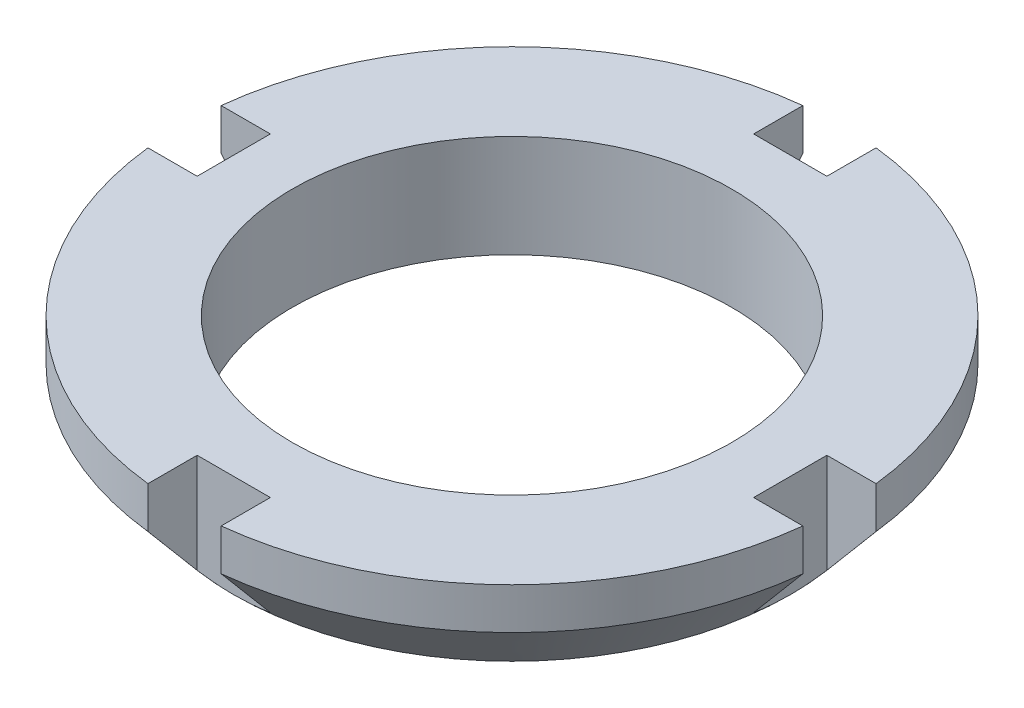
ISO-10303-21;
HEADER;
FILE_DESCRIPTION(('STEP AP214'),'2;1');
FILE_NAME('part.step','',(''),(''),'','','');
FILE_SCHEMA(('AUTOMOTIVE_DESIGN { 1 0 10303 214 1 1 1 1 }'));
ENDSEC;
DATA;
#1=APPLICATION_CONTEXT('core data for automotive mechanical design processes');
#2=APPLICATION_PROTOCOL_DEFINITION('international standard','automotive_design',2000,#1);
#3=PRODUCT_CONTEXT('',#1,'mechanical');
#4=PRODUCT('Part','Part','',(#3));
#5=PRODUCT_RELATED_PRODUCT_CATEGORY('part','',(#4));
#6=PRODUCT_DEFINITION_FORMATION('','',#4);
#7=PRODUCT_DEFINITION_CONTEXT('part definition',#1,'design');
#8=PRODUCT_DEFINITION('design','',#6,#7);
#9=PRODUCT_DEFINITION_SHAPE('','',#8);
#10=(LENGTH_UNIT() NAMED_UNIT(*) SI_UNIT(.MILLI.,.METRE.));
#11=(NAMED_UNIT(*) PLANE_ANGLE_UNIT() SI_UNIT($,.RADIAN.));
#12=(NAMED_UNIT(*) SI_UNIT($,.STERADIAN.) SOLID_ANGLE_UNIT());
#13=UNCERTAINTY_MEASURE_WITH_UNIT(LENGTH_MEASURE(1.E-05),#10,'distance_accuracy_value','');
#14=(GEOMETRIC_REPRESENTATION_CONTEXT(3) GLOBAL_UNCERTAINTY_ASSIGNED_CONTEXT((#13)) GLOBAL_UNIT_ASSIGNED_CONTEXT((#10,
#11,#12)) REPRESENTATION_CONTEXT('',''));
#15=CARTESIAN_POINT('',(0.,0.,0.));
#16=DIRECTION('',(0.,0.,1.));
#17=DIRECTION('',(1.,0.,0.));
#18=AXIS2_PLACEMENT_3D('',#15,#16,#17);
#19=CARTESIAN_POINT('',(0.,25.4,0.));
#20=DIRECTION('',(0.,1.,0.));
#21=DIRECTION('',(0.,0.,1.));
#22=AXIS2_PLACEMENT_3D('',#19,#20,#21);
#23=CYLINDRICAL_SURFACE('',#22,22.5);
#24=CARTESIAN_POINT('',(0.,4.17113757407976,0.));
#25=DIRECTION('',(0.,1.,0.));
#26=DIRECTION('',(0.,0.,1.));
#27=AXIS2_PLACEMENT_3D('',#24,#25,#26);
#28=CIRCLE('',#27,22.5);
#29=CARTESIAN_POINT('',(2.50000000000017,4.17113757407975,22.3606797749979));
#30=VERTEX_POINT('',#29);
#31=CARTESIAN_POINT('',(22.3606797749979,4.17113757407975,2.49999999999975));
#32=VERTEX_POINT('',#31);
#33=EDGE_CURVE('E186',#30,#32,#28,.T.);
#34=ORIENTED_EDGE('',*,*,#33,.T.);
#35=DIRECTION('',(0.,1.,0.));
#36=VECTOR('',#35,1.);
#37=CARTESIAN_POINT('',(22.3606797749979,0.,2.49999999999975));
#38=LINE('',#37,#36);
#39=CARTESIAN_POINT('',(22.3606797749979,7.,2.49999999999975));
#40=VERTEX_POINT('',#39);
#41=EDGE_CURVE('E171',#32,#40,#38,.T.);
#42=ORIENTED_EDGE('',*,*,#41,.T.);
#43=CARTESIAN_POINT('',(0.,7.,0.));
#44=DIRECTION('',(0.,1.,0.));
#45=DIRECTION('',(0.,0.,1.));
#46=AXIS2_PLACEMENT_3D('',#43,#44,#45);
#47=CIRCLE('',#46,22.5);
#48=CARTESIAN_POINT('',(2.50000000000017,7.,22.3606797749979));
#49=VERTEX_POINT('',#48);
#50=EDGE_CURVE('E184',#49,#40,#47,.T.);
#51=ORIENTED_EDGE('',*,*,#50,.F.);
#52=DIRECTION('',(0.,1.,0.));
#53=VECTOR('',#52,1.);
#54=CARTESIAN_POINT('',(2.50000000000017,0.,22.3606797749979));
#55=LINE('',#54,#53);
#56=EDGE_CURVE('E439',#30,#49,#55,.T.);
#57=ORIENTED_EDGE('',*,*,#56,.F.);
#58=EDGE_LOOP('',(#34,#42,#51,#57));
#59=FACE_BOUND('',#58,.T.);
#60=ADVANCED_FACE('F38',(#59),#23,.T.);
#61=CARTESIAN_POINT('',(0.,0.,0.));
#62=DIRECTION('',(0.,1.,0.));
#63=DIRECTION('',(0.,0.,1.));
#64=AXIS2_PLACEMENT_3D('',#61,#62,#63);
#65=CONICAL_SURFACE('',#64,19.,0.69813170079773);
#66=CARTESIAN_POINT('',(18.9999999999999,1.73637000129293,-7.58210621238856));
#67=CARTESIAN_POINT('',(18.9999999999999,1.53677036974403,-7.13024720071158));
#68=CARTESIAN_POINT('',(18.9999999999999,1.34993350006571,-6.67240220489217));
#69=CARTESIAN_POINT('',(18.9999999999999,1.00649976623934,-5.74464652234664));
#70=CARTESIAN_POINT('',(18.9999999999999,0.849956457997306,-5.27471610123703));
#71=CARTESIAN_POINT('',(18.9999999999999,0.573877768075691,-4.32880251710928));
#72=CARTESIAN_POINT('',(18.9999999999999,0.454004671009789,-3.85291938441721));
#73=CARTESIAN_POINT('',(19.,0.254074297918986,-2.89306623574916));
#74=CARTESIAN_POINT('',(19.,0.173993196100716,-2.40910123873751));
#75=CARTESIAN_POINT('',(19.,0.0567546419420003,-1.43181727263717));
#76=CARTESIAN_POINT('',(19.,0.019961286449687,-0.938453938233916));
#77=CARTESIAN_POINT('',(19.,-0.00757543623294828,0.049649599400212));
#78=CARTESIAN_POINT('',(19.,0.00168845560253439,0.544390007388378));
#79=CARTESIAN_POINT('',(19.,0.0659302147367227,1.53295755377141));
#80=CARTESIAN_POINT('',(19.,0.121101073277712,2.02677200049547));
#81=CARTESIAN_POINT('',(19.,0.274586154589837,3.00749402882903));
#82=CARTESIAN_POINT('',(19.,0.372897275601999,3.49440210440469));
#83=CARTESIAN_POINT('',(19.0000000000001,0.646381123210521,4.6145864154824));
#84=CARTESIAN_POINT('',(19.,0.836127071739753,5.24429515918784));
#85=CARTESIAN_POINT('',(19.0000000000001,1.27196341598445,6.48452605869457));
#86=CARTESIAN_POINT('',(19.0000000000001,1.51813336581001,7.0950197270077));
#87=CARTESIAN_POINT('',(19.0000000000001,1.92041860521065,7.9942120232412));
#88=CARTESIAN_POINT('',(19.0000000000001,2.0597111896602,8.29061541789972));
#89=CARTESIAN_POINT('',(19.0000000000001,2.34822814442477,8.87858969377929));
#90=CARTESIAN_POINT('',(19.0000000000001,2.49745323904561,9.17016022063368));
#91=CARTESIAN_POINT('',(19.0000000000001,2.80413323156645,9.74756118853287));
#92=CARTESIAN_POINT('',(19.0000000000001,2.96155628495981,10.0334086256483));
#93=CARTESIAN_POINT('',(19.0000000000001,3.28413034619789,10.6006106209937));
#94=CARTESIAN_POINT('',(19.0000000000001,3.44927922447967,10.8819663889702));
#95=CARTESIAN_POINT('',(19.0000000000001,3.61783661500378,11.1612361569684));
#96=B_SPLINE_CURVE_WITH_KNOTS('',3,(#66,#67,#68,#69,#70,#71,#72,#73,#74,#75,#76,#77,#78,#79,#80,
#81,#82,#83,#84,#85,#86,#87,#88,#89,#90,#91,#92,#93,#94,#95),.UNSPECIFIED.,.F.,.F.,(4,2,2,2,2,2,
2,2,2,2,2,2,2,2,4),(0.,1.48222106824656,2.96703907991057,4.43773962260794,5.90755850661073,
7.38965372964356,8.87198255127641,10.3605747014282,11.8490598402301,13.8187305058232,
15.7911955483557,16.7735543012806,17.755984769145,18.7348485928211,19.7134441721424),.UNSPECIFIED.);
#97=CARTESIAN_POINT('',(19.,0.,-1.94289029309402E-13));
#98=VERTEX_POINT('',#97);
#99=CARTESIAN_POINT('',(19.,0.19517097928768,2.49999999999981));
#100=VERTEX_POINT('',#99);
#101=EDGE_CURVE('E52',#98,#100,#96,.T.);
#102=ORIENTED_EDGE('',*,*,#101,.T.);
#103=CARTESIAN_POINT('',(12.821751673189,-7.07519717585949,2.49999999999986));
#104=CARTESIAN_POINT('',(13.3665510130067,-6.43787375979153,2.49999999999986));
#105=CARTESIAN_POINT('',(13.9106740738706,-5.79997326494708,2.49999999999986));
#106=CARTESIAN_POINT('',(14.9978741108621,-4.5232824494922,2.49999999999985));
#107=CARTESIAN_POINT('',(15.5409510880725,-3.88449212980409,2.49999999999984));
#108=CARTESIAN_POINT('',(16.6263652315369,-2.60628623745577,2.49999999999983));
#109=CARTESIAN_POINT('',(17.1687023995962,-1.96687066632784,2.49999999999983));
#110=CARTESIAN_POINT('',(18.2528125580392,-0.687561145140533,2.49999999999982));
#111=CARTESIAN_POINT('',(18.7945855482542,-0.0476671949381191,2.49999999999981));
#112=CARTESIAN_POINT('',(20.4192599599757,1.8725547330562,2.4999999999998));
#113=CARTESIAN_POINT('',(21.5015194094135,3.15342583739105,2.49999999999978));
#114=CARTESIAN_POINT('',(23.1241041677456,5.07541398166614,2.49999999999976));
#115=CARTESIAN_POINT('',(23.6648323574213,5.71619107610534,2.49999999999976));
#116=CARTESIAN_POINT('',(24.7460642785374,6.99793443299102,2.49999999999975));
#117=CARTESIAN_POINT('',(25.2865680100147,7.63890069540624,2.49999999999974));
#118=CARTESIAN_POINT('',(25.8269816670673,8.279942915746,2.49999999999972));
#119=B_SPLINE_CURVE_WITH_KNOTS('',3,(#103,#104,#105,#106,#107,#108,#109,#110,#111,#112,#113,
#114,#115,#116,#117,#118),.UNSPECIFIED.,.F.,.F.,(4,2,2,2,2,2,2,4),(0.,2.51532883948252,
5.03065507368705,7.54597515902335,10.0612959967228,15.0919256761954,17.6072467806086,
20.1225674695423),.UNSPECIFIED.);
#120=EDGE_CURVE('E11',#100,#32,#119,.T.);
#121=ORIENTED_EDGE('',*,*,#120,.T.);
#122=ORIENTED_EDGE('',*,*,#33,.F.);
#123=CARTESIAN_POINT('',(2.5000000000002,8.279942915746,25.8269816670672));
#124=CARTESIAN_POINT('',(2.50000000000019,7.63890069540623,25.2865680100147));
#125=CARTESIAN_POINT('',(2.50000000000018,6.99793443299102,24.7460642785373));
#126=CARTESIAN_POINT('',(2.50000000000017,5.71619107610534,23.6648323574213));
#127=CARTESIAN_POINT('',(2.50000000000017,5.07541398166614,23.1241041677456));
#128=CARTESIAN_POINT('',(2.50000000000016,3.15342583739105,21.5015194094134));
#129=CARTESIAN_POINT('',(2.50000000000015,1.8725547330562,20.4192599599756));
#130=CARTESIAN_POINT('',(2.50000000000014,-0.0476671949381199,18.7945855482542));
#131=CARTESIAN_POINT('',(2.50000000000014,-0.687561145140537,18.2528125580392));
#132=CARTESIAN_POINT('',(2.50000000000013,-1.96687066632785,17.1687023995961));
#133=CARTESIAN_POINT('',(2.50000000000012,-2.60628623745578,16.6263652315369));
#134=CARTESIAN_POINT('',(2.50000000000012,-3.8844921298041,15.5409510880725));
#135=CARTESIAN_POINT('',(2.50000000000011,-4.5232824494922,14.997874110862));
#136=CARTESIAN_POINT('',(2.5000000000001,-5.79997326494708,13.9106740738706));
#137=CARTESIAN_POINT('',(2.5000000000001,-6.43787375979153,13.3665510130066));
#138=CARTESIAN_POINT('',(2.50000000000009,-7.07519717585949,12.8217516731889));
#139=B_SPLINE_CURVE_WITH_KNOTS('',3,(#123,#124,#125,#126,#127,#128,#129,#130,#131,#132,#133,
#134,#135,#136,#137,#138),.UNSPECIFIED.,.F.,.F.,(4,2,2,2,2,2,2,4),(0.,2.51532068893367,
5.03064179334688,10.0612714728195,12.5765923105189,15.0919123958552,17.6072386300598,
20.1225674695423),.UNSPECIFIED.);
#140=CARTESIAN_POINT('',(2.50000000000014,0.19517097928768,19.));
#141=VERTEX_POINT('',#140);
#142=EDGE_CURVE('E282',#30,#141,#139,.T.);
#143=ORIENTED_EDGE('',*,*,#142,.T.);
#144=CARTESIAN_POINT('',(-7.58210621238822,1.73637000129293,19.));
#145=CARTESIAN_POINT('',(-7.13024720071124,1.53677036974405,19.0000000000001));
#146=CARTESIAN_POINT('',(-6.67240220489183,1.34993350006573,19.0000000000001));
#147=CARTESIAN_POINT('',(-5.7446465223463,1.00649976623936,19.));
#148=CARTESIAN_POINT('',(-5.27471610123669,0.849956457997325,19.));
#149=CARTESIAN_POINT('',(-4.32880251710894,0.573877768075712,19.));
#150=CARTESIAN_POINT('',(-3.85291938441687,0.454004671009814,19.));
#151=CARTESIAN_POINT('',(-2.89306623574882,0.254074297919004,19.));
#152=CARTESIAN_POINT('',(-2.40910123873717,0.173993196100722,19.));
#153=CARTESIAN_POINT('',(-1.43181727263684,0.0567546419420076,19.));
#154=CARTESIAN_POINT('',(-0.938453938233584,0.0199612864497069,19.));
#155=CARTESIAN_POINT('',(0.0496495994005433,-0.00757543623292095,19.));
#156=CARTESIAN_POINT('',(0.544390007388709,0.00168845560255643,19.));
#157=CARTESIAN_POINT('',(1.53295755377174,0.0659302147367443,19.));
#158=CARTESIAN_POINT('',(2.0267720004958,0.121101073277739,19.));
#159=CARTESIAN_POINT('',(3.00749402882936,0.274586154589858,19.));
#160=CARTESIAN_POINT('',(3.49440210440503,0.372897275602008,19.));
#161=CARTESIAN_POINT('',(4.61458641548274,0.646381123210525,19.));
#162=CARTESIAN_POINT('',(5.24429515918817,0.836127071739771,19.));
#163=CARTESIAN_POINT('',(6.48452605869491,1.27196341598448,19.));
#164=CARTESIAN_POINT('',(7.09501972700804,1.51813336581003,19.));
#165=CARTESIAN_POINT('',(7.99421202324155,1.92041860521067,19.));
#166=CARTESIAN_POINT('',(8.29061541790007,2.05971118966023,19.));
#167=CARTESIAN_POINT('',(8.87858969377964,2.34822814442479,18.9999999999999));
#168=CARTESIAN_POINT('',(9.17016022063403,2.49745323904563,18.9999999999999));
#169=CARTESIAN_POINT('',(9.74756118853323,2.80413323156648,18.9999999999999));
#170=CARTESIAN_POINT('',(10.0334086256487,2.96155628495984,18.9999999999999));
#171=CARTESIAN_POINT('',(10.6006106209941,3.28413034619792,18.9999999999999));
#172=CARTESIAN_POINT('',(10.8819663889706,3.4492792244797,18.9999999999999));
#173=CARTESIAN_POINT('',(11.1612361569687,3.6178366150038,18.9999999999999));
#174=B_SPLINE_CURVE_WITH_KNOTS('',3,(#144,#145,#146,#147,#148,#149,#150,#151,#152,#153,#154,
#155,#156,#157,#158,#159,#160,#161,#162,#163,#164,#165,#166,#167,#168,#169,#170,#171,#172,#173),
.UNSPECIFIED.,.F.,.F.,(4,2,2,2,2,2,2,2,2,2,2,2,2,2,4),(0.,1.48222106824655,2.96703907991057,
4.43773962260794,5.90755850661072,7.38965372964355,8.8719825512764,10.3605747014282,
11.8490598402301,13.8187305058232,15.7911955483557,16.7735543012806,17.7559847691451,
18.7348485928211,19.7134441721424),.UNSPECIFIED.);
#175=CARTESIAN_POINT('',(1.38777878078145E-13,0.,19.));
#176=VERTEX_POINT('',#175);
#177=EDGE_CURVE('E291',#141,#176,#174,.F.);
#178=ORIENTED_EDGE('',*,*,#177,.T.);
#179=CARTESIAN_POINT('',(0.,0.,0.));
#180=DIRECTION('',(0.,1.,0.));
#181=DIRECTION('',(0.,0.,1.));
#182=AXIS2_PLACEMENT_3D('',#179,#180,#181);
#183=CIRCLE('',#182,19.);
#184=EDGE_CURVE('E392',#176,#98,#183,.T.);
#185=ORIENTED_EDGE('',*,*,#184,.T.);
#186=EDGE_LOOP('',(#102,#121,#122,#143,#178,#185));
#187=FACE_BOUND('',#186,.T.);
#188=ADVANCED_FACE('F339',(#187),#65,.T.);
#189=CARTESIAN_POINT('',(-22.3606797749979,4.17113757407975,2.50000000000009));
#190=VERTEX_POINT('',#189);
#191=CARTESIAN_POINT('',(-2.49999999999984,4.17113757407975,22.3606797749979));
#192=VERTEX_POINT('',#191);
#193=EDGE_CURVE('E377',#190,#192,#28,.T.);
#194=ORIENTED_EDGE('',*,*,#193,.T.);
#195=DIRECTION('',(0.,1.,0.));
#196=VECTOR('',#195,1.);
#197=CARTESIAN_POINT('',(-2.49999999999984,0.,22.3606797749979));
#198=LINE('',#197,#196);
#199=CARTESIAN_POINT('',(-2.49999999999984,7.,22.3606797749979));
#200=VERTEX_POINT('',#199);
#201=EDGE_CURVE('E436',#192,#200,#198,.T.);
#202=ORIENTED_EDGE('',*,*,#201,.T.);
#203=CARTESIAN_POINT('',(-22.3606797749979,7.,2.50000000000009));
#204=VERTEX_POINT('',#203);
#205=EDGE_CURVE('E194',#204,#200,#47,.T.);
#206=ORIENTED_EDGE('',*,*,#205,.F.);
#207=DIRECTION('',(0.,1.,0.));
#208=VECTOR('',#207,1.);
#209=CARTESIAN_POINT('',(-22.3606797749979,0.,2.50000000000009));
#210=LINE('',#209,#208);
#211=EDGE_CURVE('E422',#190,#204,#210,.T.);
#212=ORIENTED_EDGE('',*,*,#211,.F.);
#213=EDGE_LOOP('',(#194,#202,#206,#212));
#214=FACE_BOUND('',#213,.T.);
#215=ADVANCED_FACE('F340',(#214),#23,.T.);
#216=CARTESIAN_POINT('',(-2.49999999999986,0.195170979287673,19.));
#217=VERTEX_POINT('',#216);
#218=EDGE_CURVE('E314',#176,#217,#174,.F.);
#219=ORIENTED_EDGE('',*,*,#218,.T.);
#220=CARTESIAN_POINT('',(-2.49999999999992,-7.07519717585949,12.8217516731889));
#221=CARTESIAN_POINT('',(-2.49999999999991,-6.43787375979153,13.3665510130067));
#222=CARTESIAN_POINT('',(-2.4999999999999,-5.79997326494708,13.9106740738706));
#223=CARTESIAN_POINT('',(-2.49999999999989,-4.5232824494922,14.9978741108621));
#224=CARTESIAN_POINT('',(-2.49999999999989,-3.8844921298041,15.5409510880725));
#225=CARTESIAN_POINT('',(-2.49999999999988,-2.60628623745577,16.6263652315369));
#226=CARTESIAN_POINT('',(-2.49999999999988,-1.96687066632784,17.1687023995962));
#227=CARTESIAN_POINT('',(-2.49999999999987,-0.687561145140531,18.2528125580392));
#228=CARTESIAN_POINT('',(-2.49999999999987,-0.0476671949381194,18.7945855482542));
#229=CARTESIAN_POINT('',(-2.49999999999986,1.8725547330562,20.4192599599757));
#230=CARTESIAN_POINT('',(-2.49999999999985,3.15342583739105,21.5015194094135));
#231=CARTESIAN_POINT('',(-2.49999999999983,5.07541398166614,23.1241041677456));
#232=CARTESIAN_POINT('',(-2.49999999999983,5.71619107610534,23.6648323574213));
#233=CARTESIAN_POINT('',(-2.49999999999982,6.99793443299101,24.7460642785373));
#234=CARTESIAN_POINT('',(-2.49999999999982,7.63890069540623,25.2865680100147));
#235=CARTESIAN_POINT('',(-2.49999999999981,8.279942915746,25.8269816670673));
#236=B_SPLINE_CURVE_WITH_KNOTS('',3,(#220,#221,#222,#223,#224,#225,#226,#227,#228,#229,#230,
#231,#232,#233,#234,#235),.UNSPECIFIED.,.F.,.F.,(4,2,2,2,2,2,2,4),(0.,2.51532883948253,
5.03065507368706,7.54597515902337,10.0612959967228,15.0919256761954,17.6072467806086,
20.1225674695423),.UNSPECIFIED.);
#237=EDGE_CURVE('E306',#217,#192,#236,.T.);
#238=ORIENTED_EDGE('',*,*,#237,.T.);
#239=ORIENTED_EDGE('',*,*,#193,.F.);
#240=CARTESIAN_POINT('',(-25.8269816670672,8.279942915746,2.50000000000009));
#241=CARTESIAN_POINT('',(-25.2865680100147,7.63890069540623,2.50000000000008));
#242=CARTESIAN_POINT('',(-24.7460642785373,6.99793443299101,2.50000000000008));
#243=CARTESIAN_POINT('',(-23.6648323574213,5.71619107610534,2.50000000000007));
#244=CARTESIAN_POINT('',(-23.1241041677456,5.07541398166614,2.50000000000007));
#245=CARTESIAN_POINT('',(-21.5015194094134,3.15342583739105,2.50000000000007));
#246=CARTESIAN_POINT('',(-20.4192599599756,1.8725547330562,2.50000000000006));
#247=CARTESIAN_POINT('',(-18.7945855482542,-0.0476671949381199,2.50000000000006));
#248=CARTESIAN_POINT('',(-18.2528125580392,-0.687561145140533,2.50000000000005));
#249=CARTESIAN_POINT('',(-17.1687023995962,-1.96687066632784,2.50000000000005));
#250=CARTESIAN_POINT('',(-16.6263652315369,-2.60628623745577,2.50000000000005));
#251=CARTESIAN_POINT('',(-15.5409510880725,-3.8844921298041,2.50000000000005));
#252=CARTESIAN_POINT('',(-14.9978741108621,-4.5232824494922,2.50000000000004));
#253=CARTESIAN_POINT('',(-13.9106740738706,-5.79997326494709,2.50000000000004));
#254=CARTESIAN_POINT('',(-13.3665510130067,-6.43787375979153,2.50000000000005));
#255=CARTESIAN_POINT('',(-12.8217516731889,-7.07519717585949,2.50000000000006));
#256=B_SPLINE_CURVE_WITH_KNOTS('',3,(#240,#241,#242,#243,#244,#245,#246,#247,#248,#249,#250,
#251,#252,#253,#254,#255),.UNSPECIFIED.,.F.,.F.,(4,2,2,2,2,2,2,4),(0.,2.51532068893366,
5.03064179334687,10.0612714728195,12.5765923105189,15.0919123958552,17.6072386300598,
20.1225674695423),.UNSPECIFIED.);
#257=CARTESIAN_POINT('',(-19.,0.195170979287673,2.50000000000006));
#258=VERTEX_POINT('',#257);
#259=EDGE_CURVE('E248',#190,#258,#256,.T.);
#260=ORIENTED_EDGE('',*,*,#259,.T.);
#261=CARTESIAN_POINT('',(-19.,1.73637000129293,-7.58210621238828));
#262=CARTESIAN_POINT('',(-19.,1.53677036974404,-7.1302472007113));
#263=CARTESIAN_POINT('',(-19.,1.34993350006572,-6.67240220489189));
#264=CARTESIAN_POINT('',(-19.,1.00649976623935,-5.74464652234636));
#265=CARTESIAN_POINT('',(-19.,0.849956457997312,-5.27471610123675));
#266=CARTESIAN_POINT('',(-19.,0.573877768075697,-4.328802517109));
#267=CARTESIAN_POINT('',(-19.,0.454004671009796,-3.85291938441693));
#268=CARTESIAN_POINT('',(-19.,0.25407429791899,-2.89306623574888));
#269=CARTESIAN_POINT('',(-19.,0.173993196100713,-2.40910123873723));
#270=CARTESIAN_POINT('',(-19.,0.0567546419420028,-1.4318172726369));
#271=CARTESIAN_POINT('',(-19.,0.0199612864496999,-0.938453938233644));
#272=CARTESIAN_POINT('',(-19.,-0.0075754362329302,0.04964959940048));
#273=CARTESIAN_POINT('',(-19.,0.00168845560254711,0.544390007388643));
#274=CARTESIAN_POINT('',(-19.,0.0659302147367331,1.53295755377167));
#275=CARTESIAN_POINT('',(-19.,0.121101073277726,2.02677200049573));
#276=CARTESIAN_POINT('',(-19.,0.274586154589847,3.00749402882928));
#277=CARTESIAN_POINT('',(-19.,0.372897275602001,3.49440210440494));
#278=CARTESIAN_POINT('',(-19.,0.646381123210519,4.61458641548265));
#279=CARTESIAN_POINT('',(-19.,0.836127071739759,5.24429515918809));
#280=CARTESIAN_POINT('',(-19.,1.27196341598446,6.48452605869482));
#281=CARTESIAN_POINT('',(-19.,1.51813336581001,7.09501972700796));
#282=CARTESIAN_POINT('',(-19.,1.92041860521066,7.99421202324147));
#283=CARTESIAN_POINT('',(-19.,2.05971118966021,8.29061541789999));
#284=CARTESIAN_POINT('',(-19.,2.34822814442478,8.87858969377956));
#285=CARTESIAN_POINT('',(-19.,2.49745323904562,9.17016022063395));
#286=CARTESIAN_POINT('',(-19.,2.80413323156646,9.74756118853314));
#287=CARTESIAN_POINT('',(-19.,2.96155628495982,10.0334086256486));
#288=CARTESIAN_POINT('',(-19.,3.2841303461979,10.600610620994));
#289=CARTESIAN_POINT('',(-19.,3.44927922447968,10.8819663889705));
#290=CARTESIAN_POINT('',(-19.,3.61783661500379,11.1612361569687));
#291=B_SPLINE_CURVE_WITH_KNOTS('',3,(#261,#262,#263,#264,#265,#266,#267,#268,#269,#270,#271,
#272,#273,#274,#275,#276,#277,#278,#279,#280,#281,#282,#283,#284,#285,#286,#287,#288,#289,#290),
.UNSPECIFIED.,.F.,.F.,(4,2,2,2,2,2,2,2,2,2,2,2,2,2,4),(0.,1.48222106824655,2.96703907991057,
4.43773962260794,5.90755850661073,7.38965372964355,8.87198255127639,10.3605747014281,
11.8490598402301,13.8187305058232,15.7911955483557,16.7735543012805,17.755984769145,
18.7348485928211,19.7134441721424),.UNSPECIFIED.);
#292=CARTESIAN_POINT('',(-19.,0.,0.));
#293=VERTEX_POINT('',#292);
#294=EDGE_CURVE('E257',#258,#293,#291,.F.);
#295=ORIENTED_EDGE('',*,*,#294,.T.);
#296=EDGE_CURVE('E386',#293,#176,#183,.T.);
#297=ORIENTED_EDGE('',*,*,#296,.T.);
#298=EDGE_LOOP('',(#219,#238,#239,#260,#295,#297));
#299=FACE_BOUND('',#298,.T.);
#300=ADVANCED_FACE('F346',(#299),#65,.T.);
#301=CARTESIAN_POINT('',(-2.5,4.17113757407975,-22.3606797749979));
#302=VERTEX_POINT('',#301);
#303=CARTESIAN_POINT('',(-22.3606797749979,4.17113757407975,-2.49999999999992));
#304=VERTEX_POINT('',#303);
#305=EDGE_CURVE('E199',#302,#304,#28,.T.);
#306=ORIENTED_EDGE('',*,*,#305,.T.);
#307=DIRECTION('',(0.,1.,0.));
#308=VECTOR('',#307,1.);
#309=CARTESIAN_POINT('',(-22.3606797749979,0.,-2.49999999999992));
#310=LINE('',#309,#308);
#311=CARTESIAN_POINT('',(-22.3606797749979,7.,-2.49999999999992));
#312=VERTEX_POINT('',#311);
#313=EDGE_CURVE('E375',#304,#312,#310,.T.);
#314=ORIENTED_EDGE('',*,*,#313,.T.);
#315=CARTESIAN_POINT('',(-2.5,7.,-22.3606797749979));
#316=VERTEX_POINT('',#315);
#317=EDGE_CURVE('E198',#316,#312,#47,.T.);
#318=ORIENTED_EDGE('',*,*,#317,.F.);
#319=DIRECTION('',(0.,1.,0.));
#320=VECTOR('',#319,1.);
#321=CARTESIAN_POINT('',(-2.5,0.,-22.3606797749979));
#322=LINE('',#321,#320);
#323=EDGE_CURVE('E376',#302,#316,#322,.T.);
#324=ORIENTED_EDGE('',*,*,#323,.F.);
#325=EDGE_LOOP('',(#306,#314,#318,#324));
#326=FACE_BOUND('',#325,.T.);
#327=ADVANCED_FACE('F350',(#326),#23,.T.);
#328=CARTESIAN_POINT('',(-19.,0.19517097928768,-2.49999999999992));
#329=VERTEX_POINT('',#328);
#330=EDGE_CURVE('E283',#293,#329,#291,.F.);
#331=ORIENTED_EDGE('',*,*,#330,.T.);
#332=CARTESIAN_POINT('',(-12.8217516731889,-7.07519717585948,-2.49999999999995));
#333=CARTESIAN_POINT('',(-13.3665510130067,-6.43787375979152,-2.49999999999994));
#334=CARTESIAN_POINT('',(-13.9106740738706,-5.79997326494708,-2.49999999999994));
#335=CARTESIAN_POINT('',(-14.9978741108621,-4.5232824494922,-2.49999999999993));
#336=CARTESIAN_POINT('',(-15.5409510880725,-3.88449212980409,-2.49999999999993));
#337=CARTESIAN_POINT('',(-16.6263652315369,-2.60628623745578,-2.49999999999993));
#338=CARTESIAN_POINT('',(-17.1687023995962,-1.96687066632785,-2.49999999999992));
#339=CARTESIAN_POINT('',(-18.2528125580392,-0.687561145140536,-2.49999999999992));
#340=CARTESIAN_POINT('',(-18.7945855482542,-0.0476671949381194,-2.49999999999992));
#341=CARTESIAN_POINT('',(-20.4192599599756,1.8725547330562,-2.49999999999992));
#342=CARTESIAN_POINT('',(-21.5015194094134,3.15342583739105,-2.49999999999991));
#343=CARTESIAN_POINT('',(-23.1241041677456,5.07541398166614,-2.4999999999999));
#344=CARTESIAN_POINT('',(-23.6648323574213,5.71619107610534,-2.4999999999999));
#345=CARTESIAN_POINT('',(-24.7460642785373,6.99793443299102,-2.4999999999999));
#346=CARTESIAN_POINT('',(-25.2865680100147,7.63890069540623,-2.49999999999991));
#347=CARTESIAN_POINT('',(-25.8269816670673,8.279942915746,-2.49999999999992));
#348=B_SPLINE_CURVE_WITH_KNOTS('',3,(#332,#333,#334,#335,#336,#337,#338,#339,#340,#341,#342,
#343,#344,#345,#346,#347),.UNSPECIFIED.,.F.,.F.,(4,2,2,2,2,2,2,4),(0.,2.51532883948252,
5.03065507368705,7.54597515902335,10.0612959967228,15.0919256761954,17.6072467806086,
20.1225674695423),.UNSPECIFIED.);
#349=EDGE_CURVE('E275',#329,#304,#348,.T.);
#350=ORIENTED_EDGE('',*,*,#349,.T.);
#351=ORIENTED_EDGE('',*,*,#305,.F.);
#352=CARTESIAN_POINT('',(-2.5,8.279942915746,-25.8269816670673));
#353=CARTESIAN_POINT('',(-2.5,7.63890069540624,-25.2865680100147));
#354=CARTESIAN_POINT('',(-2.5,6.99793443299102,-24.7460642785373));
#355=CARTESIAN_POINT('',(-2.5,5.71619107610534,-23.6648323574213));
#356=CARTESIAN_POINT('',(-2.5,5.07541398166614,-23.1241041677456));
#357=CARTESIAN_POINT('',(-2.5,3.15342583739105,-21.5015194094134));
#358=CARTESIAN_POINT('',(-2.5,1.8725547330562,-20.4192599599756));
#359=CARTESIAN_POINT('',(-2.5,-0.0476671949381191,-18.7945855482542));
#360=CARTESIAN_POINT('',(-2.5,-0.687561145140533,-18.2528125580392));
#361=CARTESIAN_POINT('',(-2.5,-1.96687066632784,-17.1687023995962));
#362=CARTESIAN_POINT('',(-2.5,-2.60628623745577,-16.6263652315369));
#363=CARTESIAN_POINT('',(-2.5,-3.88449212980409,-15.5409510880725));
#364=CARTESIAN_POINT('',(-2.5,-4.5232824494922,-14.9978741108621));
#365=CARTESIAN_POINT('',(-2.5,-5.79997326494708,-13.9106740738706));
#366=CARTESIAN_POINT('',(-2.5,-6.43787375979152,-13.3665510130067));
#367=CARTESIAN_POINT('',(-2.5,-7.07519717585949,-12.8217516731889));
#368=B_SPLINE_CURVE_WITH_KNOTS('',3,(#352,#353,#354,#355,#356,#357,#358,#359,#360,#361,#362,
#363,#364,#365,#366,#367),.UNSPECIFIED.,.F.,.F.,(4,2,2,2,2,2,2,4),(0.,2.51532068893367,
5.03064179334687,10.0612714728195,12.5765923105189,15.0919123958552,17.6072386300598,
20.1225674695423),.UNSPECIFIED.);
#369=CARTESIAN_POINT('',(-2.5,0.19517097928768,-19.));
#370=VERTEX_POINT('',#369);
#371=EDGE_CURVE('E210',#302,#370,#368,.T.);
#372=ORIENTED_EDGE('',*,*,#371,.T.);
#373=CARTESIAN_POINT('',(-7.58210621238836,1.73637000129293,-19.));
#374=CARTESIAN_POINT('',(-7.13024720071138,1.53677036974404,-19.));
#375=CARTESIAN_POINT('',(-6.67240220489197,1.34993350006572,-19.));
#376=CARTESIAN_POINT('',(-5.74464652234645,1.00649976623935,-19.));
#377=CARTESIAN_POINT('',(-5.27471610123683,0.849956457997312,-19.));
#378=CARTESIAN_POINT('',(-4.32880251710908,0.573877768075694,-19.));
#379=CARTESIAN_POINT('',(-3.85291938441702,0.45400467100979,-19.));
#380=CARTESIAN_POINT('',(-2.89306623574896,0.254074297918989,-19.));
#381=CARTESIAN_POINT('',(-2.40910123873731,0.173993196100722,-19.));
#382=CARTESIAN_POINT('',(-1.43181727263698,0.0567546419420074,-19.));
#383=CARTESIAN_POINT('',(-0.938453938233722,0.0199612864496914,-19.));
#384=CARTESIAN_POINT('',(0.0496495994004053,-0.00757543623294616,-19.));
#385=CARTESIAN_POINT('',(0.544390007388571,0.0016884556025368,-19.));
#386=CARTESIAN_POINT('',(1.53295755377161,0.065930214736723,-19.));
#387=CARTESIAN_POINT('',(2.02677200049566,0.12110107327771,-19.));
#388=CARTESIAN_POINT('',(3.00749402882922,0.274586154589838,-19.));
#389=CARTESIAN_POINT('',(3.49440210440489,0.372897275602005,-19.));
#390=CARTESIAN_POINT('',(4.6145864154826,0.64638112321053,-19.));
#391=CARTESIAN_POINT('',(5.24429515918804,0.836127071739757,-19.));
#392=CARTESIAN_POINT('',(6.48452605869478,1.27196341598445,-19.));
#393=CARTESIAN_POINT('',(7.09501972700791,1.51813336581001,-19.));
#394=CARTESIAN_POINT('',(7.99421202324141,1.92041860521065,-19.));
#395=CARTESIAN_POINT('',(8.29061541789993,2.05971118966021,-19.));
#396=CARTESIAN_POINT('',(8.8785896937795,2.34822814442478,-19.));
#397=CARTESIAN_POINT('',(9.17016022063389,2.49745323904562,-19.));
#398=CARTESIAN_POINT('',(9.74756118853309,2.80413323156646,-19.));
#399=CARTESIAN_POINT('',(10.0334086256485,2.96155628495982,-19.));
#400=CARTESIAN_POINT('',(10.6006106209939,3.2841303461979,-19.));
#401=CARTESIAN_POINT('',(10.8819663889704,3.44927922447968,-19.));
#402=CARTESIAN_POINT('',(11.1612361569686,3.61783661500379,-19.));
#403=B_SPLINE_CURVE_WITH_KNOTS('',3,(#373,#374,#375,#376,#377,#378,#379,#380,#381,#382,#383,
#384,#385,#386,#387,#388,#389,#390,#391,#392,#393,#394,#395,#396,#397,#398,#399,#400,#401,#402),
.UNSPECIFIED.,.F.,.F.,(4,2,2,2,2,2,2,2,2,2,2,2,2,2,4),(0.,1.48222106824656,2.96703907991057,
4.43773962260794,5.90755850661072,7.38965372964356,8.87198255127641,10.3605747014282,
11.8490598402301,13.8187305058232,15.7911955483557,16.7735543012806,17.7559847691451,
18.7348485928211,19.7134441721424),.UNSPECIFIED.);
#404=CARTESIAN_POINT('',(0.,0.,-19.));
#405=VERTEX_POINT('',#404);
#406=EDGE_CURVE('E218',#370,#405,#403,.T.);
#407=ORIENTED_EDGE('',*,*,#406,.T.);
#408=EDGE_CURVE('E380',#405,#293,#183,.T.);
#409=ORIENTED_EDGE('',*,*,#408,.T.);
#410=EDGE_LOOP('',(#331,#350,#351,#372,#407,#409));
#411=FACE_BOUND('',#410,.T.);
#412=ADVANCED_FACE('F358',(#411),#65,.T.);
#413=CARTESIAN_POINT('',(15.,0.,0.));
#414=DIRECTION('',(0.,1.,0.));
#415=DIRECTION('',(0.,0.,1.));
#416=AXIS2_PLACEMENT_3D('',#413,#414,#415);
#417=PLANE('',#416);
#418=ORIENTED_EDGE('',*,*,#408,.F.);
#419=EDGE_CURVE('E387',#98,#405,#183,.T.);
#420=ORIENTED_EDGE('',*,*,#419,.F.);
#421=ORIENTED_EDGE('',*,*,#184,.F.);
#422=ORIENTED_EDGE('',*,*,#296,.F.);
#423=EDGE_LOOP('',(#418,#420,#421,#422));
#424=FACE_BOUND('',#423,.T.);
#425=CARTESIAN_POINT('',(0.,0.,0.));
#426=DIRECTION('',(0.,1.,0.));
#427=DIRECTION('',(0.,0.,1.));
#428=AXIS2_PLACEMENT_3D('',#425,#426,#427);
#429=CIRCLE('',#428,15.);
#430=CARTESIAN_POINT('',(0.,0.,15.));
#431=VERTEX_POINT('',#430);
#432=EDGE_CURVE('E207',#431,#431,#429,.T.);
#433=ORIENTED_EDGE('',*,*,#432,.T.);
#434=EDGE_LOOP('',(#433));
#435=FACE_BOUND('',#434,.T.);
#436=ADVANCED_FACE('F40',(#424,#435),#417,.F.);
#437=CARTESIAN_POINT('',(0.,25.4,0.));
#438=DIRECTION('',(0.,1.,0.));
#439=DIRECTION('',(0.,0.,1.));
#440=AXIS2_PLACEMENT_3D('',#437,#438,#439);
#441=CYLINDRICAL_SURFACE('',#440,15.);
#442=ORIENTED_EDGE('',*,*,#432,.F.);
#443=EDGE_LOOP('',(#442));
#444=FACE_BOUND('',#443,.T.);
#445=CARTESIAN_POINT('',(0.,7.,0.));
#446=DIRECTION('',(0.,1.,0.));
#447=DIRECTION('',(0.,0.,1.));
#448=AXIS2_PLACEMENT_3D('',#445,#446,#447);
#449=CIRCLE('',#448,15.);
#450=CARTESIAN_POINT('',(0.,7.,15.));
#451=VERTEX_POINT('',#450);
#452=EDGE_CURVE('E203',#451,#451,#449,.T.);
#453=ORIENTED_EDGE('',*,*,#452,.T.);
#454=EDGE_LOOP('',(#453));
#455=FACE_BOUND('',#454,.T.);
#456=ADVANCED_FACE('F359',(#444,#455),#441,.F.);
#457=CARTESIAN_POINT('',(15.,7.,0.));
#458=DIRECTION('',(0.,-1.,0.));
#459=DIRECTION('',(0.,0.,-1.));
#460=AXIS2_PLACEMENT_3D('',#457,#458,#459);
#461=PLANE('',#460);
#462=ORIENTED_EDGE('',*,*,#452,.F.);
#463=EDGE_LOOP('',(#462));
#464=FACE_BOUND('',#463,.T.);
#465=ORIENTED_EDGE('',*,*,#50,.T.);
#466=DIRECTION('',(1.,0.,0.));
#467=VECTOR('',#466,1.);
#468=CARTESIAN_POINT('',(19.,7.,2.49999999999981));
#469=LINE('',#468,#467);
#470=CARTESIAN_POINT('',(19.,7.,2.49999999999981));
#471=VERTEX_POINT('',#470);
#472=EDGE_CURVE('E168',#471,#40,#469,.T.);
#473=ORIENTED_EDGE('',*,*,#472,.F.);
#474=DIRECTION('',(0.,0.,1.));
#475=VECTOR('',#474,1.);
#476=CARTESIAN_POINT('',(19.,7.,-2.5000000000002));
#477=LINE('',#476,#475);
#478=CARTESIAN_POINT('',(19.,7.,-2.5000000000002));
#479=VERTEX_POINT('',#478);
#480=EDGE_CURVE('E188',#479,#471,#477,.T.);
#481=ORIENTED_EDGE('',*,*,#480,.F.);
#482=DIRECTION('',(-1.,0.,0.));
#483=VECTOR('',#482,1.);
#484=CARTESIAN_POINT('',(19.,7.,-2.5000000000002));
#485=LINE('',#484,#483);
#486=CARTESIAN_POINT('',(22.3606797749979,7.,-2.50000000000022));
#487=VERTEX_POINT('',#486);
#488=EDGE_CURVE('E178',#487,#479,#485,.T.);
#489=ORIENTED_EDGE('',*,*,#488,.F.);
#490=CARTESIAN_POINT('',(2.5,7.,-22.3606797749979));
#491=VERTEX_POINT('',#490);
#492=EDGE_CURVE('E195',#487,#491,#47,.T.);
#493=ORIENTED_EDGE('',*,*,#492,.T.);
#494=DIRECTION('',(0.,0.,-1.));
#495=VECTOR('',#494,1.);
#496=CARTESIAN_POINT('',(2.5,7.,-19.));
#497=LINE('',#496,#495);
#498=CARTESIAN_POINT('',(2.5,7.,-19.));
#499=VERTEX_POINT('',#498);
#500=EDGE_CURVE('E416',#499,#491,#497,.T.);
#501=ORIENTED_EDGE('',*,*,#500,.F.);
#502=DIRECTION('',(1.,0.,0.));
#503=VECTOR('',#502,1.);
#504=CARTESIAN_POINT('',(-2.5,7.,-19.));
#505=LINE('',#504,#503);
#506=CARTESIAN_POINT('',(-2.5,7.,-19.));
#507=VERTEX_POINT('',#506);
#508=EDGE_CURVE('E407',#507,#499,#505,.T.);
#509=ORIENTED_EDGE('',*,*,#508,.F.);
#510=DIRECTION('',(0.,0.,1.));
#511=VECTOR('',#510,1.);
#512=CARTESIAN_POINT('',(-2.5,7.,-19.));
#513=LINE('',#512,#511);
#514=EDGE_CURVE('E411',#316,#507,#513,.T.);
#515=ORIENTED_EDGE('',*,*,#514,.F.);
#516=ORIENTED_EDGE('',*,*,#317,.T.);
#517=DIRECTION('',(-1.,0.,0.));
#518=VECTOR('',#517,1.);
#519=CARTESIAN_POINT('',(-19.,7.,-2.49999999999992));
#520=LINE('',#519,#518);
#521=CARTESIAN_POINT('',(-19.,7.,-2.49999999999992));
#522=VERTEX_POINT('',#521);
#523=EDGE_CURVE('E433',#522,#312,#520,.T.);
#524=ORIENTED_EDGE('',*,*,#523,.F.);
#525=DIRECTION('',(0.,0.,-1.));
#526=VECTOR('',#525,1.);
#527=CARTESIAN_POINT('',(-19.,7.,2.50000000000006));
#528=LINE('',#527,#526);
#529=CARTESIAN_POINT('',(-19.,7.,2.50000000000006));
#530=VERTEX_POINT('',#529);
#531=EDGE_CURVE('E423',#530,#522,#528,.T.);
#532=ORIENTED_EDGE('',*,*,#531,.F.);
#533=DIRECTION('',(1.,0.,0.));
#534=VECTOR('',#533,1.);
#535=CARTESIAN_POINT('',(-19.,7.,2.50000000000006));
#536=LINE('',#535,#534);
#537=EDGE_CURVE('E430',#204,#530,#536,.T.);
#538=ORIENTED_EDGE('',*,*,#537,.F.);
#539=ORIENTED_EDGE('',*,*,#205,.T.);
#540=DIRECTION('',(0.,0.,1.));
#541=VECTOR('',#540,1.);
#542=CARTESIAN_POINT('',(-2.49999999999986,7.,19.));
#543=LINE('',#542,#541);
#544=CARTESIAN_POINT('',(-2.49999999999986,7.,19.));
#545=VERTEX_POINT('',#544);
#546=EDGE_CURVE('E447',#545,#200,#543,.T.);
#547=ORIENTED_EDGE('',*,*,#546,.F.);
#548=DIRECTION('',(-1.,0.,0.));
#549=VECTOR('',#548,1.);
#550=CARTESIAN_POINT('',(2.50000000000014,7.,19.));
#551=LINE('',#550,#549);
#552=CARTESIAN_POINT('',(2.50000000000014,7.,19.));
#553=VERTEX_POINT('',#552);
#554=EDGE_CURVE('E440',#553,#545,#551,.T.);
#555=ORIENTED_EDGE('',*,*,#554,.F.);
#556=DIRECTION('',(0.,0.,-1.));
#557=VECTOR('',#556,1.);
#558=CARTESIAN_POINT('',(2.50000000000014,7.,19.));
#559=LINE('',#558,#557);
#560=EDGE_CURVE('E193',#49,#553,#559,.T.);
#561=ORIENTED_EDGE('',*,*,#560,.F.);
#562=EDGE_LOOP('',(#465,#473,#481,#489,#493,#501,#509,#515,#516,#524,#532,#538,#539,#547,#555,#561));
#563=FACE_BOUND('',#562,.T.);
#564=ADVANCED_FACE('F191',(#464,#563),#461,.F.);
#565=ORIENTED_EDGE('',*,*,#492,.F.);
#566=DIRECTION('',(0.,1.,0.));
#567=VECTOR('',#566,1.);
#568=CARTESIAN_POINT('',(22.3606797749979,0.,-2.50000000000022));
#569=LINE('',#568,#567);
#570=CARTESIAN_POINT('',(22.3606797749979,4.17113757407975,-2.50000000000022));
#571=VERTEX_POINT('',#570);
#572=EDGE_CURVE('E187',#571,#487,#569,.T.);
#573=ORIENTED_EDGE('',*,*,#572,.F.);
#574=CARTESIAN_POINT('',(2.5,4.17113757407975,-22.3606797749979));
#575=VERTEX_POINT('',#574);
#576=EDGE_CURVE('E378',#571,#575,#28,.T.);
#577=ORIENTED_EDGE('',*,*,#576,.T.);
#578=DIRECTION('',(0.,1.,0.));
#579=VECTOR('',#578,1.);
#580=CARTESIAN_POINT('',(2.5,0.,-22.3606797749979));
#581=LINE('',#580,#579);
#582=EDGE_CURVE('E410',#575,#491,#581,.T.);
#583=ORIENTED_EDGE('',*,*,#582,.T.);
#584=EDGE_LOOP('',(#565,#573,#577,#583));
#585=FACE_BOUND('',#584,.T.);
#586=ADVANCED_FACE('F341',(#585),#23,.T.);
#587=CARTESIAN_POINT('',(25.8269816670672,8.279942915746,-2.50000000000028));
#588=CARTESIAN_POINT('',(25.2865680100147,7.63890069540624,-2.50000000000027));
#589=CARTESIAN_POINT('',(24.7460642785373,6.99793443299102,-2.50000000000026));
#590=CARTESIAN_POINT('',(23.6648323574213,5.71619107610534,-2.50000000000024));
#591=CARTESIAN_POINT('',(23.1241041677456,5.07541398166614,-2.50000000000024));
#592=CARTESIAN_POINT('',(21.5015194094134,3.15342583739105,-2.50000000000022));
#593=CARTESIAN_POINT('',(20.4192599599756,1.8725547330562,-2.50000000000021));
#594=CARTESIAN_POINT('',(18.7945855482542,-0.0476671949381198,-2.50000000000019));
#595=CARTESIAN_POINT('',(18.2528125580392,-0.687561145140535,-2.50000000000019));
#596=CARTESIAN_POINT('',(17.1687023995961,-1.96687066632785,-2.50000000000018));
#597=CARTESIAN_POINT('',(16.6263652315369,-2.60628623745577,-2.50000000000017));
#598=CARTESIAN_POINT('',(15.5409510880724,-3.88449212980409,-2.50000000000016));
#599=CARTESIAN_POINT('',(14.997874110862,-4.5232824494922,-2.50000000000015));
#600=CARTESIAN_POINT('',(13.9106740738706,-5.79997326494708,-2.50000000000014));
#601=CARTESIAN_POINT('',(13.3665510130066,-6.43787375979152,-2.50000000000014));
#602=CARTESIAN_POINT('',(12.8217516731889,-7.07519717585948,-2.50000000000014));
#603=B_SPLINE_CURVE_WITH_KNOTS('',3,(#587,#588,#589,#590,#591,#592,#593,#594,#595,#596,#597,
#598,#599,#600,#601,#602),.UNSPECIFIED.,.F.,.F.,(4,2,2,2,2,2,2,4),(0.,2.51532068893367,
5.03064179334687,10.0612714728195,12.5765923105189,15.0919123958552,17.6072386300598,
20.1225674695423),.UNSPECIFIED.);
#604=CARTESIAN_POINT('',(19.,0.195170979287673,-2.5000000000002));
#605=VERTEX_POINT('',#604);
#606=EDGE_CURVE('E313',#571,#605,#603,.T.);
#607=ORIENTED_EDGE('',*,*,#606,.T.);
#608=EDGE_CURVE('E321',#605,#98,#96,.T.);
#609=ORIENTED_EDGE('',*,*,#608,.T.);
#610=ORIENTED_EDGE('',*,*,#419,.T.);
#611=CARTESIAN_POINT('',(2.5,0.195170979287673,-19.));
#612=VERTEX_POINT('',#611);
#613=EDGE_CURVE('E249',#405,#612,#403,.T.);
#614=ORIENTED_EDGE('',*,*,#613,.T.);
#615=CARTESIAN_POINT('',(2.5,-7.07519717585949,-12.8217516731889));
#616=CARTESIAN_POINT('',(2.5,-6.43787375979152,-13.3665510130067));
#617=CARTESIAN_POINT('',(2.5,-5.79997326494708,-13.9106740738706));
#618=CARTESIAN_POINT('',(2.5,-4.5232824494922,-14.9978741108621));
#619=CARTESIAN_POINT('',(2.5,-3.88449212980409,-15.5409510880725));
#620=CARTESIAN_POINT('',(2.5,-2.60628623745577,-16.6263652315369));
#621=CARTESIAN_POINT('',(2.5,-1.96687066632784,-17.1687023995962));
#622=CARTESIAN_POINT('',(2.5,-0.687561145140533,-18.2528125580392));
#623=CARTESIAN_POINT('',(2.5,-0.0476671949381191,-18.7945855482542));
#624=CARTESIAN_POINT('',(2.5,1.8725547330562,-20.4192599599756));
#625=CARTESIAN_POINT('',(2.5,3.15342583739105,-21.5015194094134));
#626=CARTESIAN_POINT('',(2.5,5.07541398166614,-23.1241041677456));
#627=CARTESIAN_POINT('',(2.5,5.71619107610534,-23.6648323574213));
#628=CARTESIAN_POINT('',(2.5,6.99793443299102,-24.7460642785373));
#629=CARTESIAN_POINT('',(2.5,7.63890069540624,-25.2865680100147));
#630=CARTESIAN_POINT('',(2.5,8.279942915746,-25.8269816670673));
#631=B_SPLINE_CURVE_WITH_KNOTS('',3,(#615,#616,#617,#618,#619,#620,#621,#622,#623,#624,#625,
#626,#627,#628,#629,#630),.UNSPECIFIED.,.F.,.F.,(4,2,2,2,2,2,2,4),(0.,2.51532883948252,
5.03065507368705,7.54597515902335,10.0612959967228,15.0919256761954,17.6072467806086,
20.1225674695423),.UNSPECIFIED.);
#632=EDGE_CURVE('E241',#612,#575,#631,.T.);
#633=ORIENTED_EDGE('',*,*,#632,.T.);
#634=ORIENTED_EDGE('',*,*,#576,.F.);
#635=EDGE_LOOP('',(#607,#609,#610,#614,#633,#634));
#636=FACE_BOUND('',#635,.T.);
#637=ADVANCED_FACE('F225',(#636),#65,.T.);
#638=CARTESIAN_POINT('',(2.5,0.,-19.));
#639=DIRECTION('',(1.,0.,0.));
#640=DIRECTION('',(0.,0.,-1.));
#641=AXIS2_PLACEMENT_3D('',#638,#639,#640);
#642=PLANE('',#641);
#643=DIRECTION('',(0.,1.,0.));
#644=VECTOR('',#643,1.);
#645=CARTESIAN_POINT('',(2.5,0.,-19.));
#646=LINE('',#645,#644);
#647=EDGE_CURVE('E394',#612,#499,#646,.T.);
#648=ORIENTED_EDGE('',*,*,#647,.T.);
#649=ORIENTED_EDGE('',*,*,#500,.T.);
#650=ORIENTED_EDGE('',*,*,#582,.F.);
#651=ORIENTED_EDGE('',*,*,#632,.F.);
#652=EDGE_LOOP('',(#648,#649,#650,#651));
#653=FACE_BOUND('',#652,.T.);
#654=ADVANCED_FACE('F237',(#653),#642,.F.);
#655=CARTESIAN_POINT('',(-2.5,0.,-19.));
#656=DIRECTION('',(0.,0.,1.));
#657=DIRECTION('',(1.,0.,0.));
#658=AXIS2_PLACEMENT_3D('',#655,#656,#657);
#659=PLANE('',#658);
#660=DIRECTION('',(0.,1.,0.));
#661=VECTOR('',#660,1.);
#662=CARTESIAN_POINT('',(-2.5,0.,-19.));
#663=LINE('',#662,#661);
#664=EDGE_CURVE('E400',#370,#507,#663,.T.);
#665=ORIENTED_EDGE('',*,*,#664,.T.);
#666=ORIENTED_EDGE('',*,*,#508,.T.);
#667=ORIENTED_EDGE('',*,*,#647,.F.);
#668=ORIENTED_EDGE('',*,*,#613,.F.);
#669=ORIENTED_EDGE('',*,*,#406,.F.);
#670=EDGE_LOOP('',(#665,#666,#667,#668,#669));
#671=FACE_BOUND('',#670,.T.);
#672=ADVANCED_FACE('F233',(#671),#659,.F.);
#673=CARTESIAN_POINT('',(-2.5,0.,-19.));
#674=DIRECTION('',(-1.,0.,0.));
#675=DIRECTION('',(0.,0.,1.));
#676=AXIS2_PLACEMENT_3D('',#673,#674,#675);
#677=PLANE('',#676);
#678=ORIENTED_EDGE('',*,*,#323,.T.);
#679=ORIENTED_EDGE('',*,*,#514,.T.);
#680=ORIENTED_EDGE('',*,*,#664,.F.);
#681=ORIENTED_EDGE('',*,*,#371,.F.);
#682=EDGE_LOOP('',(#678,#679,#680,#681));
#683=FACE_BOUND('',#682,.T.);
#684=ADVANCED_FACE('F229',(#683),#677,.F.);
#685=CARTESIAN_POINT('',(-19.,0.,-2.49999999999992));
#686=DIRECTION('',(0.,0.,-1.));
#687=DIRECTION('',(-1.,0.,0.));
#688=AXIS2_PLACEMENT_3D('',#685,#686,#687);
#689=PLANE('',#688);
#690=DIRECTION('',(0.,1.,0.));
#691=VECTOR('',#690,1.);
#692=CARTESIAN_POINT('',(-19.,0.,-2.49999999999992));
#693=LINE('',#692,#691);
#694=EDGE_CURVE('E418',#329,#522,#693,.T.);
#695=ORIENTED_EDGE('',*,*,#694,.T.);
#696=ORIENTED_EDGE('',*,*,#523,.T.);
#697=ORIENTED_EDGE('',*,*,#313,.F.);
#698=ORIENTED_EDGE('',*,*,#349,.F.);
#699=EDGE_LOOP('',(#695,#696,#697,#698));
#700=FACE_BOUND('',#699,.T.);
#701=ADVANCED_FACE('F232',(#700),#689,.F.);
#702=CARTESIAN_POINT('',(-19.,0.,2.50000000000006));
#703=DIRECTION('',(1.,0.,0.));
#704=DIRECTION('',(0.,0.,-1.));
#705=AXIS2_PLACEMENT_3D('',#702,#703,#704);
#706=PLANE('',#705);
#707=DIRECTION('',(0.,1.,0.));
#708=VECTOR('',#707,1.);
#709=CARTESIAN_POINT('',(-19.,0.,2.50000000000006));
#710=LINE('',#709,#708);
#711=EDGE_CURVE('E425',#258,#530,#710,.T.);
#712=ORIENTED_EDGE('',*,*,#711,.T.);
#713=ORIENTED_EDGE('',*,*,#531,.T.);
#714=ORIENTED_EDGE('',*,*,#694,.F.);
#715=ORIENTED_EDGE('',*,*,#330,.F.);
#716=ORIENTED_EDGE('',*,*,#294,.F.);
#717=EDGE_LOOP('',(#712,#713,#714,#715,#716));
#718=FACE_BOUND('',#717,.T.);
#719=ADVANCED_FACE('F268',(#718),#706,.F.);
#720=CARTESIAN_POINT('',(-19.,0.,2.50000000000006));
#721=DIRECTION('',(0.,0.,1.));
#722=DIRECTION('',(1.,0.,0.));
#723=AXIS2_PLACEMENT_3D('',#720,#721,#722);
#724=PLANE('',#723);
#725=ORIENTED_EDGE('',*,*,#211,.T.);
#726=ORIENTED_EDGE('',*,*,#537,.T.);
#727=ORIENTED_EDGE('',*,*,#711,.F.);
#728=ORIENTED_EDGE('',*,*,#259,.F.);
#729=EDGE_LOOP('',(#725,#726,#727,#728));
#730=FACE_BOUND('',#729,.T.);
#731=ADVANCED_FACE('F264',(#730),#724,.F.);
#732=CARTESIAN_POINT('',(-2.49999999999986,0.,19.));
#733=DIRECTION('',(-1.,0.,0.));
#734=DIRECTION('',(0.,0.,1.));
#735=AXIS2_PLACEMENT_3D('',#732,#733,#734);
#736=PLANE('',#735);
#737=DIRECTION('',(0.,1.,0.));
#738=VECTOR('',#737,1.);
#739=CARTESIAN_POINT('',(-2.49999999999986,0.,19.));
#740=LINE('',#739,#738);
#741=EDGE_CURVE('E435',#217,#545,#740,.T.);
#742=ORIENTED_EDGE('',*,*,#741,.T.);
#743=ORIENTED_EDGE('',*,*,#546,.T.);
#744=ORIENTED_EDGE('',*,*,#201,.F.);
#745=ORIENTED_EDGE('',*,*,#237,.F.);
#746=EDGE_LOOP('',(#742,#743,#744,#745));
#747=FACE_BOUND('',#746,.T.);
#748=ADVANCED_FACE('F267',(#747),#736,.F.);
#749=CARTESIAN_POINT('',(2.50000000000014,0.,19.));
#750=DIRECTION('',(0.,0.,-1.));
#751=DIRECTION('',(-1.,0.,0.));
#752=AXIS2_PLACEMENT_3D('',#749,#750,#751);
#753=PLANE('',#752);
#754=DIRECTION('',(0.,1.,0.));
#755=VECTOR('',#754,1.);
#756=CARTESIAN_POINT('',(2.50000000000014,0.,19.));
#757=LINE('',#756,#755);
#758=EDGE_CURVE('E67',#141,#553,#757,.T.);
#759=ORIENTED_EDGE('',*,*,#758,.T.);
#760=ORIENTED_EDGE('',*,*,#554,.T.);
#761=ORIENTED_EDGE('',*,*,#741,.F.);
#762=ORIENTED_EDGE('',*,*,#218,.F.);
#763=ORIENTED_EDGE('',*,*,#177,.F.);
#764=EDGE_LOOP('',(#759,#760,#761,#762,#763));
#765=FACE_BOUND('',#764,.T.);
#766=ADVANCED_FACE('F301',(#765),#753,.F.);
#767=CARTESIAN_POINT('',(2.50000000000014,0.,19.));
#768=DIRECTION('',(1.,0.,0.));
#769=DIRECTION('',(0.,0.,-1.));
#770=AXIS2_PLACEMENT_3D('',#767,#768,#769);
#771=PLANE('',#770);
#772=ORIENTED_EDGE('',*,*,#56,.T.);
#773=ORIENTED_EDGE('',*,*,#560,.T.);
#774=ORIENTED_EDGE('',*,*,#758,.F.);
#775=ORIENTED_EDGE('',*,*,#142,.F.);
#776=EDGE_LOOP('',(#772,#773,#774,#775));
#777=FACE_BOUND('',#776,.T.);
#778=ADVANCED_FACE('F298',(#777),#771,.F.);
#779=CARTESIAN_POINT('',(19.,0.,2.49999999999981));
#780=DIRECTION('',(0.,0.,1.));
#781=DIRECTION('',(1.,0.,0.));
#782=AXIS2_PLACEMENT_3D('',#779,#780,#781);
#783=PLANE('',#782);
#784=DIRECTION('',(0.,1.,0.));
#785=VECTOR('',#784,1.);
#786=CARTESIAN_POINT('',(19.,0.,2.49999999999981));
#787=LINE('',#786,#785);
#788=EDGE_CURVE('E173',#100,#471,#787,.T.);
#789=ORIENTED_EDGE('',*,*,#788,.T.);
#790=ORIENTED_EDGE('',*,*,#472,.T.);
#791=ORIENTED_EDGE('',*,*,#41,.F.);
#792=ORIENTED_EDGE('',*,*,#120,.F.);
#793=EDGE_LOOP('',(#789,#790,#791,#792));
#794=FACE_BOUND('',#793,.T.);
#795=ADVANCED_FACE('F170',(#794),#783,.F.);
#796=CARTESIAN_POINT('',(19.,0.,-2.5000000000002));
#797=DIRECTION('',(-1.,0.,0.));
#798=DIRECTION('',(0.,0.,1.));
#799=AXIS2_PLACEMENT_3D('',#796,#797,#798);
#800=PLANE('',#799);
#801=DIRECTION('',(0.,1.,0.));
#802=VECTOR('',#801,1.);
#803=CARTESIAN_POINT('',(19.,0.,-2.5000000000002));
#804=LINE('',#803,#802);
#805=EDGE_CURVE('E59',#605,#479,#804,.T.);
#806=ORIENTED_EDGE('',*,*,#805,.T.);
#807=ORIENTED_EDGE('',*,*,#480,.T.);
#808=ORIENTED_EDGE('',*,*,#788,.F.);
#809=ORIENTED_EDGE('',*,*,#101,.F.);
#810=ORIENTED_EDGE('',*,*,#608,.F.);
#811=EDGE_LOOP('',(#806,#807,#808,#809,#810));
#812=FACE_BOUND('',#811,.T.);
#813=ADVANCED_FACE('F330',(#812),#800,.F.);
#814=CARTESIAN_POINT('',(19.,0.,-2.5000000000002));
#815=DIRECTION('',(0.,0.,-1.));
#816=DIRECTION('',(-1.,0.,0.));
#817=AXIS2_PLACEMENT_3D('',#814,#815,#816);
#818=PLANE('',#817);
#819=ORIENTED_EDGE('',*,*,#572,.T.);
#820=ORIENTED_EDGE('',*,*,#488,.T.);
#821=ORIENTED_EDGE('',*,*,#805,.F.);
#822=ORIENTED_EDGE('',*,*,#606,.F.);
#823=EDGE_LOOP('',(#819,#820,#821,#822));
#824=FACE_BOUND('',#823,.T.);
#825=ADVANCED_FACE('F327',(#824),#818,.F.);
#826=CLOSED_SHELL('',(#60,#188,#215,#300,#327,#412,#436,#456,#564,#586,#637,#654,#672,#684,#701,
#719,#731,#748,#766,#778,#795,#813,#825));
#827=MANIFOLD_SOLID_BREP('B2',#826);
#828=ADVANCED_BREP_SHAPE_REPRESENTATION('',(#18,#827),#14);
#829=SHAPE_DEFINITION_REPRESENTATION(#9,#828);
ENDSEC;
END-ISO-10303-21;
